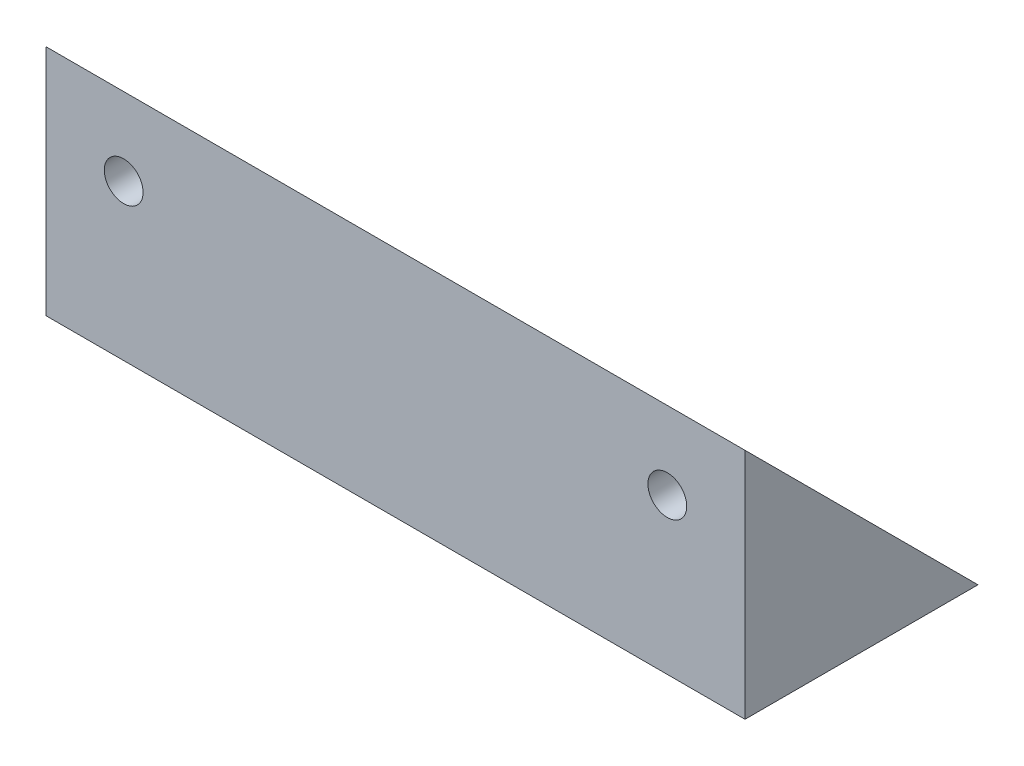
ISO-10303-21;
HEADER;
FILE_DESCRIPTION(('STEP AP214'),'2;1');
FILE_NAME('part.step','',(''),(''),'','','');
FILE_SCHEMA(('AUTOMOTIVE_DESIGN { 1 0 10303 214 1 1 1 1 }'));
ENDSEC;
DATA;
#1=APPLICATION_CONTEXT('core data for automotive mechanical design processes');
#2=APPLICATION_PROTOCOL_DEFINITION('international standard','automotive_design',2000,#1);
#3=PRODUCT_CONTEXT('',#1,'mechanical');
#4=PRODUCT('Part','Part','',(#3));
#5=PRODUCT_RELATED_PRODUCT_CATEGORY('part','',(#4));
#6=PRODUCT_DEFINITION_FORMATION('','',#4);
#7=PRODUCT_DEFINITION_CONTEXT('part definition',#1,'design');
#8=PRODUCT_DEFINITION('design','',#6,#7);
#9=PRODUCT_DEFINITION_SHAPE('','',#8);
#10=(LENGTH_UNIT() NAMED_UNIT(*) SI_UNIT(.MILLI.,.METRE.));
#11=(NAMED_UNIT(*) PLANE_ANGLE_UNIT() SI_UNIT($,.RADIAN.));
#12=(NAMED_UNIT(*) SI_UNIT($,.STERADIAN.) SOLID_ANGLE_UNIT());
#13=UNCERTAINTY_MEASURE_WITH_UNIT(LENGTH_MEASURE(1.E-05),#10,'distance_accuracy_value','');
#14=(GEOMETRIC_REPRESENTATION_CONTEXT(3) GLOBAL_UNCERTAINTY_ASSIGNED_CONTEXT((#13)) GLOBAL_UNIT_ASSIGNED_CONTEXT((#10,
#11,#12)) REPRESENTATION_CONTEXT('',''));
#15=CARTESIAN_POINT('',(0.,0.,0.));
#16=DIRECTION('',(0.,0.,1.));
#17=DIRECTION('',(1.,0.,0.));
#18=AXIS2_PLACEMENT_3D('',#15,#16,#17);
#19=CARTESIAN_POINT('',(45.,30.,0.));
#20=DIRECTION('',(0.,-0.707106781186547,0.707106781186547));
#21=DIRECTION('',(0.,-0.707106781186548,-0.707106781186548));
#22=AXIS2_PLACEMENT_3D('',#19,#20,#21);
#23=PLANE('',#22);
#24=DIRECTION('',(0.,-0.707106781186547,-0.707106781186547));
#25=VECTOR('',#24,1.);
#26=CARTESIAN_POINT('',(28.,30.,0.));
#27=LINE('',#26,#25);
#28=CARTESIAN_POINT('',(28.,25.,-5.));
#29=VERTEX_POINT('',#28);
#30=CARTESIAN_POINT('',(28.,4.99999999999999,-25.));
#31=VERTEX_POINT('',#30);
#32=EDGE_CURVE('E266',#29,#31,#27,.T.);
#33=ORIENTED_EDGE('',*,*,#32,.T.);
#34=DIRECTION('',(1.,0.,0.));
#35=VECTOR('',#34,1.);
#36=CARTESIAN_POINT('',(45.,5.00000000000001,-25.));
#37=LINE('',#36,#35);
#38=CARTESIAN_POINT('',(40.,4.99999999999999,-25.));
#39=VERTEX_POINT('',#38);
#40=EDGE_CURVE('E48',#31,#39,#37,.T.);
#41=ORIENTED_EDGE('',*,*,#40,.T.);
#42=DIRECTION('',(0.,0.707106781186547,0.707106781186547));
#43=VECTOR('',#42,1.);
#44=CARTESIAN_POINT('',(40.,30.,0.));
#45=LINE('',#44,#43);
#46=CARTESIAN_POINT('',(40.,25.,-5.));
#47=VERTEX_POINT('',#46);
#48=EDGE_CURVE('E263',#39,#47,#45,.T.);
#49=ORIENTED_EDGE('',*,*,#48,.T.);
#50=DIRECTION('',(-1.,0.,0.));
#51=VECTOR('',#50,1.);
#52=CARTESIAN_POINT('',(45.,25.,-5.));
#53=LINE('',#52,#51);
#54=EDGE_CURVE('E259',#47,#29,#53,.T.);
#55=ORIENTED_EDGE('',*,*,#54,.T.);
#56=EDGE_LOOP('',(#33,#41,#49,#55));
#57=FACE_BOUND('',#56,.T.);
#58=DIRECTION('',(0.,0.707106781186547,0.707106781186547));
#59=VECTOR('',#58,1.);
#60=CARTESIAN_POINT('',(-45.,30.,0.));
#61=LINE('',#60,#59);
#62=CARTESIAN_POINT('',(-45.,0.,-30.));
#63=VERTEX_POINT('',#62);
#64=CARTESIAN_POINT('',(-45.,30.,0.));
#65=VERTEX_POINT('',#64);
#66=EDGE_CURVE('E243',#63,#65,#61,.T.);
#67=ORIENTED_EDGE('',*,*,#66,.T.);
#68=DIRECTION('',(-1.,0.,0.));
#69=VECTOR('',#68,1.);
#70=CARTESIAN_POINT('',(45.,30.,0.));
#71=LINE('',#70,#69);
#72=CARTESIAN_POINT('',(45.,30.,0.));
#73=VERTEX_POINT('',#72);
#74=EDGE_CURVE('E251',#73,#65,#71,.T.);
#75=ORIENTED_EDGE('',*,*,#74,.F.);
#76=DIRECTION('',(0.,0.707106781186547,0.707106781186547));
#77=VECTOR('',#76,1.);
#78=CARTESIAN_POINT('',(45.,30.,0.));
#79=LINE('',#78,#77);
#80=CARTESIAN_POINT('',(45.,0.,-30.));
#81=VERTEX_POINT('',#80);
#82=EDGE_CURVE('E232',#81,#73,#79,.T.);
#83=ORIENTED_EDGE('',*,*,#82,.F.);
#84=DIRECTION('',(-1.,0.,0.));
#85=VECTOR('',#84,1.);
#86=CARTESIAN_POINT('',(45.,0.,-30.));
#87=LINE('',#86,#85);
#88=EDGE_CURVE('E255',#81,#63,#87,.T.);
#89=ORIENTED_EDGE('',*,*,#88,.T.);
#90=EDGE_LOOP('',(#67,#75,#83,#89));
#91=FACE_BOUND('',#90,.T.);
#92=DIRECTION('',(0.,-0.707106781186547,-0.707106781186547));
#93=VECTOR('',#92,1.);
#94=CARTESIAN_POINT('',(-41.,30.,0.));
#95=LINE('',#94,#93);
#96=CARTESIAN_POINT('',(-41.,25.,-5.));
#97=VERTEX_POINT('',#96);
#98=CARTESIAN_POINT('',(-41.,4.99999999999999,-25.));
#99=VERTEX_POINT('',#98);
#100=EDGE_CURVE('E275',#97,#99,#95,.T.);
#101=ORIENTED_EDGE('',*,*,#100,.T.);
#102=DIRECTION('',(1.,0.,0.));
#103=VECTOR('',#102,1.);
#104=CARTESIAN_POINT('',(45.,5.00000000000001,-25.));
#105=LINE('',#104,#103);
#106=CARTESIAN_POINT('',(-29.,4.99999999999999,-25.));
#107=VERTEX_POINT('',#106);
#108=EDGE_CURVE('E11',#99,#107,#105,.T.);
#109=ORIENTED_EDGE('',*,*,#108,.T.);
#110=DIRECTION('',(0.,0.707106781186547,0.707106781186547));
#111=VECTOR('',#110,1.);
#112=CARTESIAN_POINT('',(-29.,30.,0.));
#113=LINE('',#112,#111);
#114=CARTESIAN_POINT('',(-29.,25.,-5.));
#115=VERTEX_POINT('',#114);
#116=EDGE_CURVE('E156',#107,#115,#113,.T.);
#117=ORIENTED_EDGE('',*,*,#116,.T.);
#118=DIRECTION('',(-1.,0.,0.));
#119=VECTOR('',#118,1.);
#120=CARTESIAN_POINT('',(45.,25.,-5.));
#121=LINE('',#120,#119);
#122=EDGE_CURVE('E269',#115,#97,#121,.T.);
#123=ORIENTED_EDGE('',*,*,#122,.T.);
#124=EDGE_LOOP('',(#101,#109,#117,#123));
#125=FACE_BOUND('',#124,.T.);
#126=ADVANCED_FACE('F38',(#57,#91,#125),#23,.F.);
#127=CARTESIAN_POINT('',(28.,10.,-30.));
#128=DIRECTION('',(0.,-1.,0.));
#129=DIRECTION('',(1.,0.,0.));
#130=AXIS2_PLACEMENT_3D('',#127,#128,#129);
#131=PLANE('',#130);
#132=DIRECTION('',(1.,0.,0.));
#133=VECTOR('',#132,1.);
#134=CARTESIAN_POINT('',(28.,10.,-10.));
#135=LINE('',#134,#133);
#136=CARTESIAN_POINT('',(28.,10.,-10.));
#137=VERTEX_POINT('',#136);
#138=CARTESIAN_POINT('',(40.,10.,-10.));
#139=VERTEX_POINT('',#138);
#140=EDGE_CURVE('E286',#137,#139,#135,.T.);
#141=ORIENTED_EDGE('',*,*,#140,.F.);
#142=DIRECTION('',(0.,0.,1.));
#143=VECTOR('',#142,1.);
#144=CARTESIAN_POINT('',(28.,10.,-30.));
#145=LINE('',#144,#143);
#146=CARTESIAN_POINT('',(28.,10.,-5.));
#147=VERTEX_POINT('',#146);
#148=EDGE_CURVE('E223',#137,#147,#145,.T.);
#149=ORIENTED_EDGE('',*,*,#148,.T.);
#150=DIRECTION('',(1.,0.,0.));
#151=VECTOR('',#150,1.);
#152=CARTESIAN_POINT('',(28.,10.,-5.));
#153=LINE('',#152,#151);
#154=CARTESIAN_POINT('',(40.,10.,-5.));
#155=VERTEX_POINT('',#154);
#156=EDGE_CURVE('E214',#147,#155,#153,.T.);
#157=ORIENTED_EDGE('',*,*,#156,.T.);
#158=DIRECTION('',(0.,0.,1.));
#159=VECTOR('',#158,1.);
#160=CARTESIAN_POINT('',(40.,10.,-30.));
#161=LINE('',#160,#159);
#162=EDGE_CURVE('E196',#139,#155,#161,.T.);
#163=ORIENTED_EDGE('',*,*,#162,.F.);
#164=EDGE_LOOP('',(#141,#149,#157,#163));
#165=FACE_BOUND('',#164,.T.);
#166=ADVANCED_FACE('F327',(#165),#131,.F.);
#167=CARTESIAN_POINT('',(-41.,10.,-30.));
#168=DIRECTION('',(0.,-1.,0.));
#169=DIRECTION('',(1.,0.,0.));
#170=AXIS2_PLACEMENT_3D('',#167,#168,#169);
#171=PLANE('',#170);
#172=DIRECTION('',(1.,0.,0.));
#173=VECTOR('',#172,1.);
#174=CARTESIAN_POINT('',(-41.,10.,-10.));
#175=LINE('',#174,#173);
#176=CARTESIAN_POINT('',(-41.,10.,-10.));
#177=VERTEX_POINT('',#176);
#178=CARTESIAN_POINT('',(-29.,10.,-10.));
#179=VERTEX_POINT('',#178);
#180=EDGE_CURVE('E139',#177,#179,#175,.T.);
#181=ORIENTED_EDGE('',*,*,#180,.F.);
#182=DIRECTION('',(0.,0.,1.));
#183=VECTOR('',#182,1.);
#184=CARTESIAN_POINT('',(-41.,10.,-30.));
#185=LINE('',#184,#183);
#186=CARTESIAN_POINT('',(-41.,10.,-5.));
#187=VERTEX_POINT('',#186);
#188=EDGE_CURVE('E203',#177,#187,#185,.T.);
#189=ORIENTED_EDGE('',*,*,#188,.T.);
#190=DIRECTION('',(1.,0.,0.));
#191=VECTOR('',#190,1.);
#192=CARTESIAN_POINT('',(-41.,10.,-5.));
#193=LINE('',#192,#191);
#194=CARTESIAN_POINT('',(-29.,10.,-5.));
#195=VERTEX_POINT('',#194);
#196=EDGE_CURVE('E195',#187,#195,#193,.T.);
#197=ORIENTED_EDGE('',*,*,#196,.T.);
#198=DIRECTION('',(0.,0.,1.));
#199=VECTOR('',#198,1.);
#200=CARTESIAN_POINT('',(-29.,10.,-30.));
#201=LINE('',#200,#199);
#202=EDGE_CURVE('E204',#179,#195,#201,.T.);
#203=ORIENTED_EDGE('',*,*,#202,.F.);
#204=EDGE_LOOP('',(#181,#189,#197,#203));
#205=FACE_BOUND('',#204,.T.);
#206=ADVANCED_FACE('F332',(#205),#171,.F.);
#207=CARTESIAN_POINT('',(45.,0.,-30.));
#208=DIRECTION('',(0.,1.,0.));
#209=DIRECTION('',(0.,0.,1.));
#210=AXIS2_PLACEMENT_3D('',#207,#208,#209);
#211=PLANE('',#210);
#212=CARTESIAN_POINT('',(-35.,0.,-20.));
#213=DIRECTION('',(0.,1.,0.));
#214=DIRECTION('',(1.,0.,0.));
#215=AXIS2_PLACEMENT_3D('',#212,#213,#214);
#216=CIRCLE('',#215,2.5);
#217=CARTESIAN_POINT('',(-32.5,0.,-20.));
#218=VERTEX_POINT('',#217);
#219=EDGE_CURVE('E294',#218,#218,#216,.T.);
#220=ORIENTED_EDGE('',*,*,#219,.T.);
#221=EDGE_LOOP('',(#220));
#222=FACE_BOUND('',#221,.T.);
#223=CARTESIAN_POINT('',(35.,0.,-20.));
#224=DIRECTION('',(0.,1.,0.));
#225=DIRECTION('',(1.,0.,0.));
#226=AXIS2_PLACEMENT_3D('',#223,#224,#225);
#227=CIRCLE('',#226,2.5);
#228=CARTESIAN_POINT('',(37.5,0.,-20.));
#229=VERTEX_POINT('',#228);
#230=EDGE_CURVE('E301',#229,#229,#227,.T.);
#231=ORIENTED_EDGE('',*,*,#230,.T.);
#232=EDGE_LOOP('',(#231));
#233=FACE_BOUND('',#232,.T.);
#234=DIRECTION('',(0.,0.,-1.));
#235=VECTOR('',#234,1.);
#236=CARTESIAN_POINT('',(-45.,0.,-30.));
#237=LINE('',#236,#235);
#238=CARTESIAN_POINT('',(-45.,0.,0.));
#239=VERTEX_POINT('',#238);
#240=EDGE_CURVE('E207',#239,#63,#237,.T.);
#241=ORIENTED_EDGE('',*,*,#240,.T.);
#242=ORIENTED_EDGE('',*,*,#88,.F.);
#243=DIRECTION('',(0.,0.,-1.));
#244=VECTOR('',#243,1.);
#245=CARTESIAN_POINT('',(45.,0.,-30.));
#246=LINE('',#245,#244);
#247=CARTESIAN_POINT('',(45.,0.,0.));
#248=VERTEX_POINT('',#247);
#249=EDGE_CURVE('E228',#248,#81,#246,.T.);
#250=ORIENTED_EDGE('',*,*,#249,.F.);
#251=DIRECTION('',(-1.,0.,0.));
#252=VECTOR('',#251,1.);
#253=CARTESIAN_POINT('',(45.,0.,0.));
#254=LINE('',#253,#252);
#255=EDGE_CURVE('E239',#248,#239,#254,.T.);
#256=ORIENTED_EDGE('',*,*,#255,.T.);
#257=EDGE_LOOP('',(#241,#242,#250,#256));
#258=FACE_BOUND('',#257,.T.);
#259=ADVANCED_FACE('F40',(#222,#233,#258),#211,.F.);
#260=CARTESIAN_POINT('',(45.,0.,0.));
#261=DIRECTION('',(0.,0.,-1.));
#262=DIRECTION('',(-1.,0.,0.));
#263=AXIS2_PLACEMENT_3D('',#260,#261,#262);
#264=PLANE('',#263);
#265=CARTESIAN_POINT('',(-35.,20.,0.));
#266=DIRECTION('',(0.,0.,1.));
#267=DIRECTION('',(1.,0.,0.));
#268=AXIS2_PLACEMENT_3D('',#265,#266,#267);
#269=CIRCLE('',#268,2.5);
#270=CARTESIAN_POINT('',(-32.5,20.,0.));
#271=VERTEX_POINT('',#270);
#272=EDGE_CURVE('E183',#271,#271,#269,.T.);
#273=ORIENTED_EDGE('',*,*,#272,.F.);
#274=EDGE_LOOP('',(#273));
#275=FACE_BOUND('',#274,.T.);
#276=CARTESIAN_POINT('',(35.,20.,0.));
#277=DIRECTION('',(0.,0.,1.));
#278=DIRECTION('',(1.,0.,0.));
#279=AXIS2_PLACEMENT_3D('',#276,#277,#278);
#280=CIRCLE('',#279,2.5);
#281=CARTESIAN_POINT('',(37.5,20.,0.));
#282=VERTEX_POINT('',#281);
#283=EDGE_CURVE('E165',#282,#282,#280,.T.);
#284=ORIENTED_EDGE('',*,*,#283,.F.);
#285=EDGE_LOOP('',(#284));
#286=FACE_BOUND('',#285,.T.);
#287=DIRECTION('',(0.,-1.,0.));
#288=VECTOR('',#287,1.);
#289=CARTESIAN_POINT('',(-45.,0.,0.));
#290=LINE('',#289,#288);
#291=EDGE_CURVE('E233',#65,#239,#290,.T.);
#292=ORIENTED_EDGE('',*,*,#291,.T.);
#293=ORIENTED_EDGE('',*,*,#255,.F.);
#294=DIRECTION('',(0.,-1.,0.));
#295=VECTOR('',#294,1.);
#296=CARTESIAN_POINT('',(45.,0.,0.));
#297=LINE('',#296,#295);
#298=EDGE_CURVE('E236',#73,#248,#297,.T.);
#299=ORIENTED_EDGE('',*,*,#298,.F.);
#300=ORIENTED_EDGE('',*,*,#74,.T.);
#301=EDGE_LOOP('',(#292,#293,#299,#300));
#302=FACE_BOUND('',#301,.T.);
#303=ADVANCED_FACE('F337',(#275,#286,#302),#264,.F.);
#304=CARTESIAN_POINT('',(45.,0.,0.));
#305=DIRECTION('',(-1.,0.,0.));
#306=DIRECTION('',(0.,0.,1.));
#307=AXIS2_PLACEMENT_3D('',#304,#305,#306);
#308=PLANE('',#307);
#309=ORIENTED_EDGE('',*,*,#249,.T.);
#310=ORIENTED_EDGE('',*,*,#82,.T.);
#311=ORIENTED_EDGE('',*,*,#298,.T.);
#312=EDGE_LOOP('',(#309,#310,#311));
#313=FACE_BOUND('',#312,.T.);
#314=ADVANCED_FACE('F340',(#313),#308,.F.);
#315=CARTESIAN_POINT('',(-45.,0.,0.));
#316=DIRECTION('',(-1.,0.,0.));
#317=DIRECTION('',(0.,0.,1.));
#318=AXIS2_PLACEMENT_3D('',#315,#316,#317);
#319=PLANE('',#318);
#320=ORIENTED_EDGE('',*,*,#240,.F.);
#321=ORIENTED_EDGE('',*,*,#291,.F.);
#322=ORIENTED_EDGE('',*,*,#66,.F.);
#323=EDGE_LOOP('',(#320,#321,#322));
#324=FACE_BOUND('',#323,.T.);
#325=ADVANCED_FACE('F342',(#324),#319,.T.);
#326=CARTESIAN_POINT('',(28.,30.,-30.));
#327=DIRECTION('',(-1.,0.,0.));
#328=DIRECTION('',(0.,-1.,0.));
#329=AXIS2_PLACEMENT_3D('',#326,#327,#328);
#330=PLANE('',#329);
#331=DIRECTION('',(0.,0.,1.));
#332=VECTOR('',#331,1.);
#333=CARTESIAN_POINT('',(28.,4.99999999999999,-30.));
#334=LINE('',#333,#332);
#335=CARTESIAN_POINT('',(28.,5.,-10.));
#336=VERTEX_POINT('',#335);
#337=EDGE_CURVE('E167',#31,#336,#334,.T.);
#338=ORIENTED_EDGE('',*,*,#337,.F.);
#339=ORIENTED_EDGE('',*,*,#32,.F.);
#340=DIRECTION('',(0.,-1.,0.));
#341=VECTOR('',#340,1.);
#342=CARTESIAN_POINT('',(28.,30.,-5.));
#343=LINE('',#342,#341);
#344=EDGE_CURVE('E210',#29,#147,#343,.T.);
#345=ORIENTED_EDGE('',*,*,#344,.T.);
#346=ORIENTED_EDGE('',*,*,#148,.F.);
#347=DIRECTION('',(0.,-1.,0.));
#348=VECTOR('',#347,1.);
#349=CARTESIAN_POINT('',(28.,30.,-9.99999999999999));
#350=LINE('',#349,#348);
#351=EDGE_CURVE('E160',#137,#336,#350,.T.);
#352=ORIENTED_EDGE('',*,*,#351,.T.);
#353=EDGE_LOOP('',(#338,#339,#345,#346,#352));
#354=FACE_BOUND('',#353,.T.);
#355=ADVANCED_FACE('F345',(#354),#330,.F.);
#356=CARTESIAN_POINT('',(40.,30.,-30.));
#357=DIRECTION('',(1.,0.,0.));
#358=DIRECTION('',(0.,1.,0.));
#359=AXIS2_PLACEMENT_3D('',#356,#357,#358);
#360=PLANE('',#359);
#361=ORIENTED_EDGE('',*,*,#48,.F.);
#362=DIRECTION('',(0.,0.,-1.));
#363=VECTOR('',#362,1.);
#364=CARTESIAN_POINT('',(40.,4.99999999999999,-30.));
#365=LINE('',#364,#363);
#366=CARTESIAN_POINT('',(40.,5.,-10.));
#367=VERTEX_POINT('',#366);
#368=EDGE_CURVE('E170',#367,#39,#365,.T.);
#369=ORIENTED_EDGE('',*,*,#368,.F.);
#370=DIRECTION('',(0.,-1.,0.));
#371=VECTOR('',#370,1.);
#372=CARTESIAN_POINT('',(40.,30.,-9.99999999999999));
#373=LINE('',#372,#371);
#374=EDGE_CURVE('E56',#139,#367,#373,.T.);
#375=ORIENTED_EDGE('',*,*,#374,.F.);
#376=ORIENTED_EDGE('',*,*,#162,.T.);
#377=DIRECTION('',(0.,1.,0.));
#378=VECTOR('',#377,1.);
#379=CARTESIAN_POINT('',(40.,30.,-5.));
#380=LINE('',#379,#378);
#381=EDGE_CURVE('E219',#155,#47,#380,.T.);
#382=ORIENTED_EDGE('',*,*,#381,.T.);
#383=EDGE_LOOP('',(#361,#369,#375,#376,#382));
#384=FACE_BOUND('',#383,.T.);
#385=ADVANCED_FACE('F351',(#384),#360,.F.);
#386=CARTESIAN_POINT('',(0.,0.,-5.));
#387=DIRECTION('',(0.,0.,1.));
#388=DIRECTION('',(1.,0.,0.));
#389=AXIS2_PLACEMENT_3D('',#386,#387,#388);
#390=PLANE('',#389);
#391=CARTESIAN_POINT('',(35.,20.,-5.));
#392=DIRECTION('',(0.,0.,1.));
#393=DIRECTION('',(1.,0.,0.));
#394=AXIS2_PLACEMENT_3D('',#391,#392,#393);
#395=CIRCLE('',#394,2.5);
#396=CARTESIAN_POINT('',(37.5,20.,-5.));
#397=VERTEX_POINT('',#396);
#398=EDGE_CURVE('E215',#397,#397,#395,.T.);
#399=ORIENTED_EDGE('',*,*,#398,.T.);
#400=EDGE_LOOP('',(#399));
#401=FACE_BOUND('',#400,.T.);
#402=ORIENTED_EDGE('',*,*,#381,.F.);
#403=ORIENTED_EDGE('',*,*,#156,.F.);
#404=ORIENTED_EDGE('',*,*,#344,.F.);
#405=ORIENTED_EDGE('',*,*,#54,.F.);
#406=EDGE_LOOP('',(#402,#403,#404,#405));
#407=FACE_BOUND('',#406,.T.);
#408=ADVANCED_FACE('F356',(#401,#407),#390,.F.);
#409=CARTESIAN_POINT('',(-41.,30.,-30.));
#410=DIRECTION('',(-1.,0.,0.));
#411=DIRECTION('',(0.,0.,1.));
#412=AXIS2_PLACEMENT_3D('',#409,#410,#411);
#413=PLANE('',#412);
#414=DIRECTION('',(0.,0.,1.));
#415=VECTOR('',#414,1.);
#416=CARTESIAN_POINT('',(-41.,4.99999999999999,-30.));
#417=LINE('',#416,#415);
#418=CARTESIAN_POINT('',(-41.,5.,-10.));
#419=VERTEX_POINT('',#418);
#420=EDGE_CURVE('E150',#99,#419,#417,.T.);
#421=ORIENTED_EDGE('',*,*,#420,.F.);
#422=ORIENTED_EDGE('',*,*,#100,.F.);
#423=DIRECTION('',(0.,-1.,0.));
#424=VECTOR('',#423,1.);
#425=CARTESIAN_POINT('',(-41.,30.,-5.));
#426=LINE('',#425,#424);
#427=EDGE_CURVE('E191',#97,#187,#426,.T.);
#428=ORIENTED_EDGE('',*,*,#427,.T.);
#429=ORIENTED_EDGE('',*,*,#188,.F.);
#430=DIRECTION('',(0.,-1.,0.));
#431=VECTOR('',#430,1.);
#432=CARTESIAN_POINT('',(-41.,30.,-9.99999999999999));
#433=LINE('',#432,#431);
#434=EDGE_CURVE('E142',#177,#419,#433,.T.);
#435=ORIENTED_EDGE('',*,*,#434,.T.);
#436=EDGE_LOOP('',(#421,#422,#428,#429,#435));
#437=FACE_BOUND('',#436,.T.);
#438=ADVANCED_FACE('F359',(#437),#413,.F.);
#439=CARTESIAN_POINT('',(-29.,30.,-30.));
#440=DIRECTION('',(1.,0.,0.));
#441=DIRECTION('',(0.,1.,0.));
#442=AXIS2_PLACEMENT_3D('',#439,#440,#441);
#443=PLANE('',#442);
#444=ORIENTED_EDGE('',*,*,#116,.F.);
#445=DIRECTION('',(0.,0.,-1.));
#446=VECTOR('',#445,1.);
#447=CARTESIAN_POINT('',(-29.,4.99999999999999,-30.));
#448=LINE('',#447,#446);
#449=CARTESIAN_POINT('',(-29.,5.,-10.));
#450=VERTEX_POINT('',#449);
#451=EDGE_CURVE('E148',#450,#107,#448,.T.);
#452=ORIENTED_EDGE('',*,*,#451,.F.);
#453=DIRECTION('',(0.,-1.,0.));
#454=VECTOR('',#453,1.);
#455=CARTESIAN_POINT('',(-29.,30.,-9.99999999999999));
#456=LINE('',#455,#454);
#457=EDGE_CURVE('E64',#179,#450,#456,.T.);
#458=ORIENTED_EDGE('',*,*,#457,.F.);
#459=ORIENTED_EDGE('',*,*,#202,.T.);
#460=DIRECTION('',(0.,1.,0.));
#461=VECTOR('',#460,1.);
#462=CARTESIAN_POINT('',(-29.,30.,-5.));
#463=LINE('',#462,#461);
#464=EDGE_CURVE('E200',#195,#115,#463,.T.);
#465=ORIENTED_EDGE('',*,*,#464,.T.);
#466=EDGE_LOOP('',(#444,#452,#458,#459,#465));
#467=FACE_BOUND('',#466,.T.);
#468=ADVANCED_FACE('F154',(#467),#443,.F.);
#469=CARTESIAN_POINT('',(0.,0.,-5.));
#470=DIRECTION('',(0.,0.,1.));
#471=DIRECTION('',(1.,0.,0.));
#472=AXIS2_PLACEMENT_3D('',#469,#470,#471);
#473=PLANE('',#472);
#474=CARTESIAN_POINT('',(-35.,20.,-5.));
#475=DIRECTION('',(0.,0.,1.));
#476=DIRECTION('',(1.,0.,0.));
#477=AXIS2_PLACEMENT_3D('',#474,#475,#476);
#478=CIRCLE('',#477,2.5);
#479=CARTESIAN_POINT('',(-32.5,20.,-5.));
#480=VERTEX_POINT('',#479);
#481=EDGE_CURVE('E187',#480,#480,#478,.T.);
#482=ORIENTED_EDGE('',*,*,#481,.T.);
#483=EDGE_LOOP('',(#482));
#484=FACE_BOUND('',#483,.T.);
#485=ORIENTED_EDGE('',*,*,#464,.F.);
#486=ORIENTED_EDGE('',*,*,#196,.F.);
#487=ORIENTED_EDGE('',*,*,#427,.F.);
#488=ORIENTED_EDGE('',*,*,#122,.F.);
#489=EDGE_LOOP('',(#485,#486,#487,#488));
#490=FACE_BOUND('',#489,.T.);
#491=ADVANCED_FACE('F369',(#484,#490),#473,.F.);
#492=CARTESIAN_POINT('',(-35.,20.,-30.));
#493=DIRECTION('',(0.,0.,1.));
#494=DIRECTION('',(1.,0.,0.));
#495=AXIS2_PLACEMENT_3D('',#492,#493,#494);
#496=CYLINDRICAL_SURFACE('',#495,2.5);
#497=ORIENTED_EDGE('',*,*,#272,.T.);
#498=EDGE_LOOP('',(#497));
#499=FACE_BOUND('',#498,.T.);
#500=ORIENTED_EDGE('',*,*,#481,.F.);
#501=EDGE_LOOP('',(#500));
#502=FACE_BOUND('',#501,.T.);
#503=ADVANCED_FACE('F372',(#499,#502),#496,.F.);
#504=CARTESIAN_POINT('',(35.,20.,-30.));
#505=DIRECTION('',(0.,0.,1.));
#506=DIRECTION('',(1.,0.,0.));
#507=AXIS2_PLACEMENT_3D('',#504,#505,#506);
#508=CYLINDRICAL_SURFACE('',#507,2.5);
#509=ORIENTED_EDGE('',*,*,#283,.T.);
#510=EDGE_LOOP('',(#509));
#511=FACE_BOUND('',#510,.T.);
#512=ORIENTED_EDGE('',*,*,#398,.F.);
#513=EDGE_LOOP('',(#512));
#514=FACE_BOUND('',#513,.T.);
#515=ADVANCED_FACE('F374',(#511,#514),#508,.F.);
#516=CARTESIAN_POINT('',(0.,5.,0.));
#517=DIRECTION('',(0.,-1.,0.));
#518=DIRECTION('',(1.,0.,0.));
#519=AXIS2_PLACEMENT_3D('',#516,#517,#518);
#520=PLANE('',#519);
#521=CARTESIAN_POINT('',(-35.,5.,-20.));
#522=DIRECTION('',(0.,-1.,0.));
#523=DIRECTION('',(0.,0.,-1.));
#524=AXIS2_PLACEMENT_3D('',#521,#522,#523);
#525=CIRCLE('',#524,2.5);
#526=CARTESIAN_POINT('',(-35.,5.00000000000001,-22.5));
#527=VERTEX_POINT('',#526);
#528=EDGE_CURVE('E42',#527,#527,#525,.F.);
#529=ORIENTED_EDGE('',*,*,#528,.F.);
#530=EDGE_LOOP('',(#529));
#531=FACE_BOUND('',#530,.T.);
#532=ORIENTED_EDGE('',*,*,#420,.T.);
#533=DIRECTION('',(1.,0.,0.));
#534=VECTOR('',#533,1.);
#535=CARTESIAN_POINT('',(-41.,5.,-10.));
#536=LINE('',#535,#534);
#537=EDGE_CURVE('E137',#419,#450,#536,.T.);
#538=ORIENTED_EDGE('',*,*,#537,.T.);
#539=ORIENTED_EDGE('',*,*,#451,.T.);
#540=ORIENTED_EDGE('',*,*,#108,.F.);
#541=EDGE_LOOP('',(#532,#538,#539,#540));
#542=FACE_BOUND('',#541,.T.);
#543=ADVANCED_FACE('F146',(#531,#542),#520,.F.);
#544=CARTESIAN_POINT('',(-41.,30.,-9.99999999999999));
#545=DIRECTION('',(0.,0.,-1.));
#546=DIRECTION('',(0.,1.,0.));
#547=AXIS2_PLACEMENT_3D('',#544,#545,#546);
#548=PLANE('',#547);
#549=ORIENTED_EDGE('',*,*,#180,.T.);
#550=ORIENTED_EDGE('',*,*,#457,.T.);
#551=ORIENTED_EDGE('',*,*,#537,.F.);
#552=ORIENTED_EDGE('',*,*,#434,.F.);
#553=EDGE_LOOP('',(#549,#550,#551,#552));
#554=FACE_BOUND('',#553,.T.);
#555=ADVANCED_FACE('F136',(#554),#548,.T.);
#556=CARTESIAN_POINT('',(0.,5.,0.));
#557=DIRECTION('',(0.,-1.,0.));
#558=DIRECTION('',(1.,0.,0.));
#559=AXIS2_PLACEMENT_3D('',#556,#557,#558);
#560=PLANE('',#559);
#561=CARTESIAN_POINT('',(35.,5.,-20.));
#562=DIRECTION('',(0.,-1.,0.));
#563=DIRECTION('',(0.,0.,-1.));
#564=AXIS2_PLACEMENT_3D('',#561,#562,#563);
#565=CIRCLE('',#564,2.5);
#566=CARTESIAN_POINT('',(35.,5.00000000000001,-22.5));
#567=VERTEX_POINT('',#566);
#568=EDGE_CURVE('E291',#567,#567,#565,.F.);
#569=ORIENTED_EDGE('',*,*,#568,.F.);
#570=EDGE_LOOP('',(#569));
#571=FACE_BOUND('',#570,.T.);
#572=ORIENTED_EDGE('',*,*,#337,.T.);
#573=DIRECTION('',(1.,0.,0.));
#574=VECTOR('',#573,1.);
#575=CARTESIAN_POINT('',(28.,5.,-10.));
#576=LINE('',#575,#574);
#577=EDGE_CURVE('E174',#336,#367,#576,.T.);
#578=ORIENTED_EDGE('',*,*,#577,.T.);
#579=ORIENTED_EDGE('',*,*,#368,.T.);
#580=ORIENTED_EDGE('',*,*,#40,.F.);
#581=EDGE_LOOP('',(#572,#578,#579,#580));
#582=FACE_BOUND('',#581,.T.);
#583=ADVANCED_FACE('F322',(#571,#582),#560,.F.);
#584=CARTESIAN_POINT('',(28.,30.,-9.99999999999999));
#585=DIRECTION('',(0.,0.,-1.));
#586=DIRECTION('',(0.,1.,0.));
#587=AXIS2_PLACEMENT_3D('',#584,#585,#586);
#588=PLANE('',#587);
#589=ORIENTED_EDGE('',*,*,#140,.T.);
#590=ORIENTED_EDGE('',*,*,#374,.T.);
#591=ORIENTED_EDGE('',*,*,#577,.F.);
#592=ORIENTED_EDGE('',*,*,#351,.F.);
#593=EDGE_LOOP('',(#589,#590,#591,#592));
#594=FACE_BOUND('',#593,.T.);
#595=ADVANCED_FACE('F314',(#594),#588,.T.);
#596=CARTESIAN_POINT('',(35.,30.,-20.));
#597=DIRECTION('',(0.,-1.,0.));
#598=DIRECTION('',(0.,0.,-1.));
#599=AXIS2_PLACEMENT_3D('',#596,#597,#598);
#600=CYLINDRICAL_SURFACE('',#599,2.5);
#601=ORIENTED_EDGE('',*,*,#230,.F.);
#602=EDGE_LOOP('',(#601));
#603=FACE_BOUND('',#602,.T.);
#604=ORIENTED_EDGE('',*,*,#568,.T.);
#605=EDGE_LOOP('',(#604));
#606=FACE_BOUND('',#605,.T.);
#607=ADVANCED_FACE('F311',(#603,#606),#600,.F.);
#608=CARTESIAN_POINT('',(-35.,30.,-20.));
#609=DIRECTION('',(0.,-1.,0.));
#610=DIRECTION('',(0.,0.,-1.));
#611=AXIS2_PLACEMENT_3D('',#608,#609,#610);
#612=CYLINDRICAL_SURFACE('',#611,2.5);
#613=ORIENTED_EDGE('',*,*,#219,.F.);
#614=EDGE_LOOP('',(#613));
#615=FACE_BOUND('',#614,.T.);
#616=ORIENTED_EDGE('',*,*,#528,.T.);
#617=EDGE_LOOP('',(#616));
#618=FACE_BOUND('',#617,.T.);
#619=ADVANCED_FACE('F313',(#615,#618),#612,.F.);
#620=CLOSED_SHELL('',(#126,#166,#206,#259,#303,#314,#325,#355,#385,#408,#438,#468,#491,#503,
#515,#543,#555,#583,#595,#607,#619));
#621=MANIFOLD_SOLID_BREP('B2',#620);
#622=ADVANCED_BREP_SHAPE_REPRESENTATION('',(#18,#621),#14);
#623=SHAPE_DEFINITION_REPRESENTATION(#9,#622);
ENDSEC;
END-ISO-10303-21;
